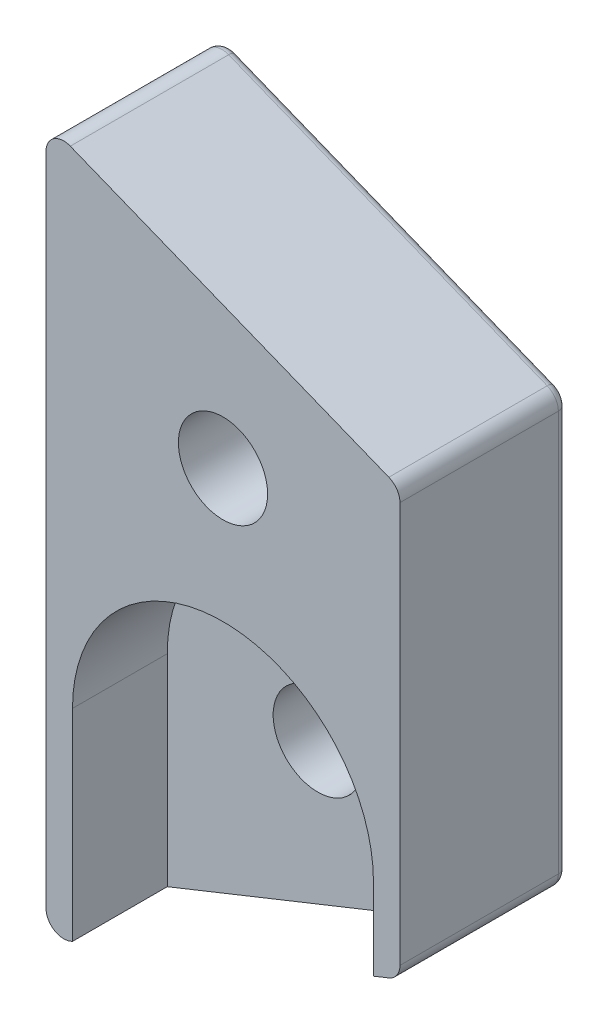
ISO-10303-21;
HEADER;
FILE_DESCRIPTION(('STEP AP214'),'2;1');
FILE_NAME('part.step','',(''),(''),'','','');
FILE_SCHEMA(('AUTOMOTIVE_DESIGN { 1 0 10303 214 1 1 1 1 }'));
ENDSEC;
DATA;
#1=APPLICATION_CONTEXT('core data for automotive mechanical design processes');
#2=APPLICATION_PROTOCOL_DEFINITION('international standard','automotive_design',2000,#1);
#3=PRODUCT_CONTEXT('',#1,'mechanical');
#4=PRODUCT('Part','Part','',(#3));
#5=PRODUCT_RELATED_PRODUCT_CATEGORY('part','',(#4));
#6=PRODUCT_DEFINITION_FORMATION('','',#4);
#7=PRODUCT_DEFINITION_CONTEXT('part definition',#1,'design');
#8=PRODUCT_DEFINITION('design','',#6,#7);
#9=PRODUCT_DEFINITION_SHAPE('','',#8);
#10=(LENGTH_UNIT() NAMED_UNIT(*) SI_UNIT(.MILLI.,.METRE.));
#11=(NAMED_UNIT(*) PLANE_ANGLE_UNIT() SI_UNIT($,.RADIAN.));
#12=(NAMED_UNIT(*) SI_UNIT($,.STERADIAN.) SOLID_ANGLE_UNIT());
#13=UNCERTAINTY_MEASURE_WITH_UNIT(LENGTH_MEASURE(1.E-05),#10,'distance_accuracy_value','');
#14=(GEOMETRIC_REPRESENTATION_CONTEXT(3) GLOBAL_UNCERTAINTY_ASSIGNED_CONTEXT((#13)) GLOBAL_UNIT_ASSIGNED_CONTEXT((#10,
#11,#12)) REPRESENTATION_CONTEXT('',''));
#15=CARTESIAN_POINT('',(0.,0.,0.));
#16=DIRECTION('',(0.,0.,1.));
#17=DIRECTION('',(1.,0.,0.));
#18=AXIS2_PLACEMENT_3D('',#15,#16,#17);
#19=CARTESIAN_POINT('',(7.9375,-22.225,7.5));
#20=DIRECTION('',(0.,0.,-1.));
#21=DIRECTION('',(-1.,0.,0.));
#22=AXIS2_PLACEMENT_3D('',#19,#20,#21);
#23=CYLINDRICAL_SURFACE('',#22,2.);
#24=CARTESIAN_POINT('',(7.9375,-22.225,0.));
#25=DIRECTION('',(0.,0.,1.));
#26=DIRECTION('',(1.,0.,0.));
#27=AXIS2_PLACEMENT_3D('',#24,#25,#26);
#28=CIRCLE('',#27,2.);
#29=CARTESIAN_POINT('',(9.9375,-22.225,0.));
#30=VERTEX_POINT('',#29);
#31=EDGE_CURVE('E249',#30,#30,#28,.T.);
#32=ORIENTED_EDGE('',*,*,#31,.F.);
#33=EDGE_LOOP('',(#32));
#34=FACE_BOUND('',#33,.T.);
#35=CARTESIAN_POINT('',(7.9375,-22.225,3.25));
#36=DIRECTION('',(0.,0.,1.));
#37=DIRECTION('',(1.,0.,0.));
#38=AXIS2_PLACEMENT_3D('',#35,#36,#37);
#39=CIRCLE('',#38,2.);
#40=CARTESIAN_POINT('',(9.9375,-22.225,3.25));
#41=VERTEX_POINT('',#40);
#42=EDGE_CURVE('E236',#41,#41,#39,.T.);
#43=ORIENTED_EDGE('',*,*,#42,.T.);
#44=EDGE_LOOP('',(#43));
#45=FACE_BOUND('',#44,.T.);
#46=ADVANCED_FACE('F50',(#34,#45),#23,.F.);
#47=CARTESIAN_POINT('',(0.,0.,7.5));
#48=DIRECTION('',(0.,0.,-1.));
#49=DIRECTION('',(-1.,0.,0.));
#50=AXIS2_PLACEMENT_3D('',#47,#48,#49);
#51=PLANE('',#50);
#52=CARTESIAN_POINT('',(7.9375,-22.225,7.5));
#53=DIRECTION('',(0.,0.,1.));
#54=DIRECTION('',(1.,0.,0.));
#55=AXIS2_PLACEMENT_3D('',#52,#53,#54);
#56=CIRCLE('',#55,6.75);
#57=CARTESIAN_POINT('',(14.6875,-22.225,7.5));
#58=VERTEX_POINT('',#57);
#59=CARTESIAN_POINT('',(1.1875,-22.225,7.5));
#60=VERTEX_POINT('',#59);
#61=EDGE_CURVE('E203',#58,#60,#56,.T.);
#62=ORIENTED_EDGE('',*,*,#61,.F.);
#63=DIRECTION('',(0.,1.,0.));
#64=VECTOR('',#63,1.);
#65=CARTESIAN_POINT('',(14.6875,-22.225,7.5));
#66=LINE('',#65,#64);
#67=CARTESIAN_POINT('',(14.6875,-25.875,7.5));
#68=VERTEX_POINT('',#67);
#69=EDGE_CURVE('E219',#68,#58,#66,.T.);
#70=ORIENTED_EDGE('',*,*,#69,.F.);
#71=DIRECTION('',(0.928476690885259,0.371390676354104,0.));
#72=VECTOR('',#71,1.);
#73=CARTESIAN_POINT('',(15.875,-25.4,7.5));
#74=LINE('',#73,#72);
#75=CARTESIAN_POINT('',(15.3760413493561,-25.5995834602576,7.5));
#76=VERTEX_POINT('',#75);
#77=EDGE_CURVE('E257',#68,#76,#74,.T.);
#78=ORIENTED_EDGE('',*,*,#77,.T.);
#79=CARTESIAN_POINT('',(15.08125,-24.8626050868674,7.5));
#80=DIRECTION('',(0.,0.,-1.));
#81=DIRECTION('',(-1.,0.,0.));
#82=AXIS2_PLACEMENT_3D('',#79,#80,#81);
#83=CIRCLE('',#82,0.79375);
#84=CARTESIAN_POINT('',(15.875,-24.8626050868674,7.5));
#85=VERTEX_POINT('',#84);
#86=EDGE_CURVE('E295',#76,#85,#83,.F.);
#87=ORIENTED_EDGE('',*,*,#86,.T.);
#88=DIRECTION('',(0.,1.,0.));
#89=VECTOR('',#88,1.);
#90=CARTESIAN_POINT('',(15.875,-6.35,7.5));
#91=LINE('',#90,#89);
#92=CARTESIAN_POINT('',(15.875,-6.8873949131326,7.5));
#93=VERTEX_POINT('',#92);
#94=EDGE_CURVE('E264',#85,#93,#91,.T.);
#95=ORIENTED_EDGE('',*,*,#94,.T.);
#96=CARTESIAN_POINT('',(15.08125,-6.8873949131326,7.5));
#97=DIRECTION('',(0.,0.,-1.));
#98=DIRECTION('',(-1.,0.,0.));
#99=AXIS2_PLACEMENT_3D('',#96,#97,#98);
#100=CIRCLE('',#99,0.79375);
#101=CARTESIAN_POINT('',(15.3760413493561,-6.15041653974242,7.5));
#102=VERTEX_POINT('',#101);
#103=EDGE_CURVE('E286',#93,#102,#100,.F.);
#104=ORIENTED_EDGE('',*,*,#103,.T.);
#105=DIRECTION('',(-0.928476690885259,0.371390676354103,0.));
#106=VECTOR('',#105,1.);
#107=CARTESIAN_POINT('',(0.,0.,7.5));
#108=LINE('',#107,#106);
#109=CARTESIAN_POINT('',(1.08854134935607,-0.435416539742427,7.5));
#110=VERTEX_POINT('',#109);
#111=EDGE_CURVE('E267',#102,#110,#108,.T.);
#112=ORIENTED_EDGE('',*,*,#111,.T.);
#113=CARTESIAN_POINT('',(0.79375,-1.1723949131326,7.5));
#114=DIRECTION('',(0.,0.,-1.));
#115=DIRECTION('',(-1.,0.,0.));
#116=AXIS2_PLACEMENT_3D('',#113,#114,#115);
#117=CIRCLE('',#116,0.79375);
#118=CARTESIAN_POINT('',(0.,-1.1723949131326,7.5));
#119=VERTEX_POINT('',#118);
#120=EDGE_CURVE('E287',#110,#119,#117,.F.);
#121=ORIENTED_EDGE('',*,*,#120,.T.);
#122=DIRECTION('',(0.,-1.,0.));
#123=VECTOR('',#122,1.);
#124=CARTESIAN_POINT('',(0.,-31.75,7.5));
#125=LINE('',#124,#123);
#126=CARTESIAN_POINT('',(0.,-30.5776050868674,7.5));
#127=VERTEX_POINT('',#126);
#128=EDGE_CURVE('E258',#119,#127,#125,.T.);
#129=ORIENTED_EDGE('',*,*,#128,.T.);
#130=CARTESIAN_POINT('',(0.793749999999999,-30.5776050868674,7.5));
#131=DIRECTION('',(0.,0.,-1.));
#132=DIRECTION('',(-1.,0.,0.));
#133=AXIS2_PLACEMENT_3D('',#130,#131,#132);
#134=CIRCLE('',#133,0.79375);
#135=CARTESIAN_POINT('',(1.08854134935607,-31.3145834602576,7.5));
#136=VERTEX_POINT('',#135);
#137=EDGE_CURVE('E293',#127,#136,#134,.F.);
#138=ORIENTED_EDGE('',*,*,#137,.T.);
#139=CARTESIAN_POINT('',(1.1875,-31.275,7.5));
#140=VERTEX_POINT('',#139);
#141=EDGE_CURVE('E261',#136,#140,#74,.T.);
#142=ORIENTED_EDGE('',*,*,#141,.T.);
#143=DIRECTION('',(0.,-1.,0.));
#144=VECTOR('',#143,1.);
#145=CARTESIAN_POINT('',(1.1875,-22.225,7.5));
#146=LINE('',#145,#144);
#147=EDGE_CURVE('E221',#60,#140,#146,.T.);
#148=ORIENTED_EDGE('',*,*,#147,.F.);
#149=EDGE_LOOP('',(#62,#70,#78,#87,#95,#104,#112,#121,#129,#138,#142,#148));
#150=FACE_BOUND('',#149,.T.);
#151=CARTESIAN_POINT('',(7.9375,-9.525,7.5));
#152=DIRECTION('',(0.,0.,1.));
#153=DIRECTION('',(1.,0.,0.));
#154=AXIS2_PLACEMENT_3D('',#151,#152,#153);
#155=CIRCLE('',#154,2.);
#156=CARTESIAN_POINT('',(9.9375,-9.525,7.5));
#157=VERTEX_POINT('',#156);
#158=EDGE_CURVE('E244',#157,#157,#155,.T.);
#159=ORIENTED_EDGE('',*,*,#158,.F.);
#160=EDGE_LOOP('',(#159));
#161=FACE_BOUND('',#160,.T.);
#162=ADVANCED_FACE('F409',(#150,#161),#51,.F.);
#163=CARTESIAN_POINT('',(0.,0.,0.));
#164=DIRECTION('',(0.,0.,-1.));
#165=DIRECTION('',(-1.,0.,0.));
#166=AXIS2_PLACEMENT_3D('',#163,#164,#165);
#167=PLANE('',#166);
#168=DIRECTION('',(-0.928476690885259,0.371390676354103,0.));
#169=VECTOR('',#168,1.);
#170=CARTESIAN_POINT('',(15.228645674678,-6.51890572643751,0.));
#171=LINE('',#170,#169);
#172=CARTESIAN_POINT('',(0.941145674678034,-0.803905726437515,0.));
#173=VERTEX_POINT('',#172);
#174=CARTESIAN_POINT('',(15.228645674678,-6.51890572643751,0.));
#175=VERTEX_POINT('',#174);
#176=EDGE_CURVE('E313',#173,#175,#171,.F.);
#177=ORIENTED_EDGE('',*,*,#176,.T.);
#178=CARTESIAN_POINT('',(15.08125,-6.8873949131326,0.));
#179=DIRECTION('',(0.,0.,-1.));
#180=DIRECTION('',(-1.,0.,0.));
#181=AXIS2_PLACEMENT_3D('',#178,#179,#180);
#182=CIRCLE('',#181,0.396875);
#183=CARTESIAN_POINT('',(15.478125,-6.8873949131326,0.));
#184=VERTEX_POINT('',#183);
#185=EDGE_CURVE('E333',#175,#184,#182,.T.);
#186=ORIENTED_EDGE('',*,*,#185,.T.);
#187=DIRECTION('',(0.,1.,0.));
#188=VECTOR('',#187,1.);
#189=CARTESIAN_POINT('',(15.478125,-24.8626050868674,0.));
#190=LINE('',#189,#188);
#191=CARTESIAN_POINT('',(15.478125,-24.8626050868674,0.));
#192=VERTEX_POINT('',#191);
#193=EDGE_CURVE('E335',#184,#192,#190,.F.);
#194=ORIENTED_EDGE('',*,*,#193,.T.);
#195=CARTESIAN_POINT('',(15.08125,-24.8626050868674,0.));
#196=DIRECTION('',(0.,0.,-1.));
#197=DIRECTION('',(-1.,0.,0.));
#198=AXIS2_PLACEMENT_3D('',#195,#196,#197);
#199=CIRCLE('',#198,0.396875);
#200=CARTESIAN_POINT('',(15.228645674678,-25.2310942735625,0.));
#201=VERTEX_POINT('',#200);
#202=EDGE_CURVE('E328',#192,#201,#199,.T.);
#203=ORIENTED_EDGE('',*,*,#202,.T.);
#204=DIRECTION('',(0.928476690885259,0.371390676354104,0.));
#205=VECTOR('',#204,1.);
#206=CARTESIAN_POINT('',(0.94114567467803,-30.9460942735625,0.));
#207=LINE('',#206,#205);
#208=CARTESIAN_POINT('',(0.941145674678031,-30.9460942735625,0.));
#209=VERTEX_POINT('',#208);
#210=EDGE_CURVE('E326',#201,#209,#207,.F.);
#211=ORIENTED_EDGE('',*,*,#210,.T.);
#212=CARTESIAN_POINT('',(0.793749999999999,-30.5776050868674,0.));
#213=DIRECTION('',(0.,0.,-1.));
#214=DIRECTION('',(-1.,0.,0.));
#215=AXIS2_PLACEMENT_3D('',#212,#213,#214);
#216=CIRCLE('',#215,0.396875);
#217=CARTESIAN_POINT('',(0.396875,-30.5776050868674,0.));
#218=VERTEX_POINT('',#217);
#219=EDGE_CURVE('E323',#209,#218,#216,.T.);
#220=ORIENTED_EDGE('',*,*,#219,.T.);
#221=DIRECTION('',(0.,-1.,0.));
#222=VECTOR('',#221,1.);
#223=CARTESIAN_POINT('',(0.396875,-1.1723949131326,0.));
#224=LINE('',#223,#222);
#225=CARTESIAN_POINT('',(0.396875,-1.1723949131326,0.));
#226=VERTEX_POINT('',#225);
#227=EDGE_CURVE('E319',#218,#226,#224,.F.);
#228=ORIENTED_EDGE('',*,*,#227,.T.);
#229=CARTESIAN_POINT('',(0.79375,-1.1723949131326,0.));
#230=DIRECTION('',(0.,0.,-1.));
#231=DIRECTION('',(-1.,0.,0.));
#232=AXIS2_PLACEMENT_3D('',#229,#230,#231);
#233=CIRCLE('',#232,0.396875);
#234=EDGE_CURVE('E320',#226,#173,#233,.T.);
#235=ORIENTED_EDGE('',*,*,#234,.T.);
#236=EDGE_LOOP('',(#177,#186,#194,#203,#211,#220,#228,#235));
#237=FACE_BOUND('',#236,.T.);
#238=ORIENTED_EDGE('',*,*,#31,.T.);
#239=EDGE_LOOP('',(#238));
#240=FACE_BOUND('',#239,.T.);
#241=CARTESIAN_POINT('',(7.9375,-9.525,0.));
#242=DIRECTION('',(0.,0.,1.));
#243=DIRECTION('',(1.,0.,0.));
#244=AXIS2_PLACEMENT_3D('',#241,#242,#243);
#245=CIRCLE('',#244,2.);
#246=CARTESIAN_POINT('',(9.9375,-9.525,0.));
#247=VERTEX_POINT('',#246);
#248=EDGE_CURVE('E246',#247,#247,#245,.T.);
#249=ORIENTED_EDGE('',*,*,#248,.T.);
#250=EDGE_LOOP('',(#249));
#251=FACE_BOUND('',#250,.T.);
#252=ADVANCED_FACE('F430',(#237,#240,#251),#167,.T.);
#253=CARTESIAN_POINT('',(0.,-31.75,7.5));
#254=DIRECTION('',(1.,0.,0.));
#255=DIRECTION('',(0.,0.,-1.));
#256=AXIS2_PLACEMENT_3D('',#253,#254,#255);
#257=PLANE('',#256);
#258=DIRECTION('',(0.,0.,-1.));
#259=VECTOR('',#258,1.);
#260=CARTESIAN_POINT('',(0.,-1.1723949131326,7.5));
#261=LINE('',#260,#259);
#262=CARTESIAN_POINT('',(0.,-1.1723949131326,0.396874999999998));
#263=VERTEX_POINT('',#262);
#264=EDGE_CURVE('E278',#119,#263,#261,.T.);
#265=ORIENTED_EDGE('',*,*,#264,.T.);
#266=DIRECTION('',(0.,-1.,0.));
#267=VECTOR('',#266,1.);
#268=CARTESIAN_POINT('',(0.,-30.5776050868674,0.396875));
#269=LINE('',#268,#267);
#270=CARTESIAN_POINT('',(0.,-30.5776050868674,0.396875));
#271=VERTEX_POINT('',#270);
#272=EDGE_CURVE('E352',#263,#271,#269,.T.);
#273=ORIENTED_EDGE('',*,*,#272,.T.);
#274=DIRECTION('',(0.,0.,-1.));
#275=VECTOR('',#274,1.);
#276=CARTESIAN_POINT('',(0.,-30.5776050868674,7.5));
#277=LINE('',#276,#275);
#278=EDGE_CURVE('E281',#271,#127,#277,.F.);
#279=ORIENTED_EDGE('',*,*,#278,.T.);
#280=ORIENTED_EDGE('',*,*,#128,.F.);
#281=EDGE_LOOP('',(#265,#273,#279,#280));
#282=FACE_BOUND('',#281,.T.);
#283=ADVANCED_FACE('F411',(#282),#257,.F.);
#284=CARTESIAN_POINT('',(15.875,-25.4,7.5));
#285=DIRECTION('',(-0.371390676354104,0.928476690885259,0.));
#286=DIRECTION('',(-0.928476690885259,-0.371390676354104,0.));
#287=AXIS2_PLACEMENT_3D('',#284,#285,#286);
#288=PLANE('',#287);
#289=DIRECTION('',(0.,0.,-1.));
#290=VECTOR('',#289,1.);
#291=CARTESIAN_POINT('',(1.08854134935607,-31.3145834602576,7.5));
#292=LINE('',#291,#290);
#293=CARTESIAN_POINT('',(1.08854134935607,-31.3145834602576,0.396875));
#294=VERTEX_POINT('',#293);
#295=EDGE_CURVE('E277',#136,#294,#292,.T.);
#296=ORIENTED_EDGE('',*,*,#295,.T.);
#297=DIRECTION('',(0.928476690885259,0.371390676354104,0.));
#298=VECTOR('',#297,1.);
#299=CARTESIAN_POINT('',(15.3760413493561,-25.5995834602576,0.396875));
#300=LINE('',#299,#298);
#301=CARTESIAN_POINT('',(15.3760413493561,-25.5995834602576,0.396875));
#302=VERTEX_POINT('',#301);
#303=EDGE_CURVE('E349',#294,#302,#300,.T.);
#304=ORIENTED_EDGE('',*,*,#303,.T.);
#305=DIRECTION('',(0.,0.,-1.));
#306=VECTOR('',#305,1.);
#307=CARTESIAN_POINT('',(15.3760413493561,-25.5995834602576,7.5));
#308=LINE('',#307,#306);
#309=EDGE_CURVE('E272',#302,#76,#308,.F.);
#310=ORIENTED_EDGE('',*,*,#309,.T.);
#311=ORIENTED_EDGE('',*,*,#77,.F.);
#312=DIRECTION('',(0.,0.,1.));
#313=VECTOR('',#312,1.);
#314=CARTESIAN_POINT('',(14.6875,-25.875,3.25));
#315=LINE('',#314,#313);
#316=CARTESIAN_POINT('',(14.6875,-25.875,3.25));
#317=VERTEX_POINT('',#316);
#318=EDGE_CURVE('E239',#317,#68,#315,.T.);
#319=ORIENTED_EDGE('',*,*,#318,.F.);
#320=DIRECTION('',(0.928476690885259,0.371390676354104,0.));
#321=VECTOR('',#320,1.);
#322=CARTESIAN_POINT('',(1.1875,-31.275,3.25));
#323=LINE('',#322,#321);
#324=CARTESIAN_POINT('',(1.1875,-31.275,3.25));
#325=VERTEX_POINT('',#324);
#326=EDGE_CURVE('E214',#325,#317,#323,.T.);
#327=ORIENTED_EDGE('',*,*,#326,.F.);
#328=DIRECTION('',(0.,0.,1.));
#329=VECTOR('',#328,1.);
#330=CARTESIAN_POINT('',(1.1875,-31.275,3.25));
#331=LINE('',#330,#329);
#332=EDGE_CURVE('E202',#325,#140,#331,.T.);
#333=ORIENTED_EDGE('',*,*,#332,.T.);
#334=ORIENTED_EDGE('',*,*,#141,.F.);
#335=EDGE_LOOP('',(#296,#304,#310,#311,#319,#327,#333,#334));
#336=FACE_BOUND('',#335,.T.);
#337=ADVANCED_FACE('F408',(#336),#288,.F.);
#338=CARTESIAN_POINT('',(15.875,-6.35,7.5));
#339=DIRECTION('',(-1.,0.,0.));
#340=DIRECTION('',(0.,0.,1.));
#341=AXIS2_PLACEMENT_3D('',#338,#339,#340);
#342=PLANE('',#341);
#343=DIRECTION('',(0.,0.,-1.));
#344=VECTOR('',#343,1.);
#345=CARTESIAN_POINT('',(15.875,-24.8626050868674,7.5));
#346=LINE('',#345,#344);
#347=CARTESIAN_POINT('',(15.875,-24.8626050868674,0.396875));
#348=VERTEX_POINT('',#347);
#349=EDGE_CURVE('E302',#85,#348,#346,.T.);
#350=ORIENTED_EDGE('',*,*,#349,.T.);
#351=DIRECTION('',(0.,1.,0.));
#352=VECTOR('',#351,1.);
#353=CARTESIAN_POINT('',(15.875,-6.8873949131326,0.396875));
#354=LINE('',#353,#352);
#355=CARTESIAN_POINT('',(15.875,-6.8873949131326,0.396875));
#356=VERTEX_POINT('',#355);
#357=EDGE_CURVE('E344',#348,#356,#354,.T.);
#358=ORIENTED_EDGE('',*,*,#357,.T.);
#359=DIRECTION('',(0.,0.,-1.));
#360=VECTOR('',#359,1.);
#361=CARTESIAN_POINT('',(15.875,-6.8873949131326,7.5));
#362=LINE('',#361,#360);
#363=EDGE_CURVE('E296',#356,#93,#362,.F.);
#364=ORIENTED_EDGE('',*,*,#363,.T.);
#365=ORIENTED_EDGE('',*,*,#94,.F.);
#366=EDGE_LOOP('',(#350,#358,#364,#365));
#367=FACE_BOUND('',#366,.T.);
#368=ADVANCED_FACE('F444',(#367),#342,.F.);
#369=CARTESIAN_POINT('',(0.,0.,7.5));
#370=DIRECTION('',(-0.371390676354103,-0.928476690885259,0.));
#371=DIRECTION('',(0.92847669088526,-0.371390676354104,0.));
#372=AXIS2_PLACEMENT_3D('',#369,#370,#371);
#373=PLANE('',#372);
#374=DIRECTION('',(0.,0.,-1.));
#375=VECTOR('',#374,1.);
#376=CARTESIAN_POINT('',(15.3760413493561,-6.15041653974242,7.5));
#377=LINE('',#376,#375);
#378=CARTESIAN_POINT('',(15.3760413493561,-6.15041653974242,0.396875));
#379=VERTEX_POINT('',#378);
#380=EDGE_CURVE('E306',#102,#379,#377,.T.);
#381=ORIENTED_EDGE('',*,*,#380,.T.);
#382=DIRECTION('',(-0.92847669088526,0.371390676354104,0.));
#383=VECTOR('',#382,1.);
#384=CARTESIAN_POINT('',(1.08854134935607,-0.435416539742427,0.396875));
#385=LINE('',#384,#383);
#386=CARTESIAN_POINT('',(1.08854134935607,-0.435416539742427,0.396875));
#387=VERTEX_POINT('',#386);
#388=EDGE_CURVE('E11',#379,#387,#385,.T.);
#389=ORIENTED_EDGE('',*,*,#388,.T.);
#390=DIRECTION('',(0.,0.,-1.));
#391=VECTOR('',#390,1.);
#392=CARTESIAN_POINT('',(1.08854134935607,-0.435416539742427,7.5));
#393=LINE('',#392,#391);
#394=EDGE_CURVE('E303',#387,#110,#393,.F.);
#395=ORIENTED_EDGE('',*,*,#394,.T.);
#396=ORIENTED_EDGE('',*,*,#111,.F.);
#397=EDGE_LOOP('',(#381,#389,#395,#396));
#398=FACE_BOUND('',#397,.T.);
#399=ADVANCED_FACE('F452',(#398),#373,.F.);
#400=CARTESIAN_POINT('',(7.9375,-9.525,7.5));
#401=DIRECTION('',(0.,0.,-1.));
#402=DIRECTION('',(-1.,0.,0.));
#403=AXIS2_PLACEMENT_3D('',#400,#401,#402);
#404=CYLINDRICAL_SURFACE('',#403,2.);
#405=ORIENTED_EDGE('',*,*,#158,.T.);
#406=EDGE_LOOP('',(#405));
#407=FACE_BOUND('',#406,.T.);
#408=ORIENTED_EDGE('',*,*,#248,.F.);
#409=EDGE_LOOP('',(#408));
#410=FACE_BOUND('',#409,.T.);
#411=ADVANCED_FACE('F454',(#407,#410),#404,.F.);
#412=CARTESIAN_POINT('',(0.793749999999999,-30.5776050868674,7.5));
#413=DIRECTION('',(0.,0.,-1.));
#414=DIRECTION('',(-1.,0.,0.));
#415=AXIS2_PLACEMENT_3D('',#412,#413,#414);
#416=CYLINDRICAL_SURFACE('',#415,0.79375);
#417=ORIENTED_EDGE('',*,*,#278,.F.);
#418=CARTESIAN_POINT('',(0.793749999999999,-30.5776050868674,0.396875));
#419=DIRECTION('',(0.,0.,-1.));
#420=DIRECTION('',(-1.,0.,0.));
#421=AXIS2_PLACEMENT_3D('',#418,#419,#420);
#422=CIRCLE('',#421,0.79375);
#423=EDGE_CURVE('E355',#271,#294,#422,.F.);
#424=ORIENTED_EDGE('',*,*,#423,.T.);
#425=ORIENTED_EDGE('',*,*,#295,.F.);
#426=ORIENTED_EDGE('',*,*,#137,.F.);
#427=EDGE_LOOP('',(#417,#424,#425,#426));
#428=FACE_BOUND('',#427,.T.);
#429=ADVANCED_FACE('F405',(#428),#416,.T.);
#430=CARTESIAN_POINT('',(15.08125,-24.8626050868674,7.5));
#431=DIRECTION('',(0.,0.,-1.));
#432=DIRECTION('',(-1.,0.,0.));
#433=AXIS2_PLACEMENT_3D('',#430,#431,#432);
#434=CYLINDRICAL_SURFACE('',#433,0.79375);
#435=ORIENTED_EDGE('',*,*,#309,.F.);
#436=CARTESIAN_POINT('',(15.08125,-24.8626050868674,0.396875));
#437=DIRECTION('',(0.,0.,-1.));
#438=DIRECTION('',(-1.,0.,0.));
#439=AXIS2_PLACEMENT_3D('',#436,#437,#438);
#440=CIRCLE('',#439,0.79375);
#441=EDGE_CURVE('E347',#302,#348,#440,.F.);
#442=ORIENTED_EDGE('',*,*,#441,.T.);
#443=ORIENTED_EDGE('',*,*,#349,.F.);
#444=ORIENTED_EDGE('',*,*,#86,.F.);
#445=EDGE_LOOP('',(#435,#442,#443,#444));
#446=FACE_BOUND('',#445,.T.);
#447=ADVANCED_FACE('F438',(#446),#434,.T.);
#448=CARTESIAN_POINT('',(15.08125,-6.8873949131326,7.5));
#449=DIRECTION('',(0.,0.,-1.));
#450=DIRECTION('',(-1.,0.,0.));
#451=AXIS2_PLACEMENT_3D('',#448,#449,#450);
#452=CYLINDRICAL_SURFACE('',#451,0.79375);
#453=ORIENTED_EDGE('',*,*,#363,.F.);
#454=CARTESIAN_POINT('',(15.08125,-6.8873949131326,0.396874999999998));
#455=DIRECTION('',(0.,0.,-1.));
#456=DIRECTION('',(-1.,0.,0.));
#457=AXIS2_PLACEMENT_3D('',#454,#455,#456);
#458=CIRCLE('',#457,0.79375);
#459=EDGE_CURVE('E339',#356,#379,#458,.F.);
#460=ORIENTED_EDGE('',*,*,#459,.T.);
#461=ORIENTED_EDGE('',*,*,#380,.F.);
#462=ORIENTED_EDGE('',*,*,#103,.F.);
#463=EDGE_LOOP('',(#453,#460,#461,#462));
#464=FACE_BOUND('',#463,.T.);
#465=ADVANCED_FACE('F449',(#464),#452,.T.);
#466=CARTESIAN_POINT('',(0.79375,-1.1723949131326,7.5));
#467=DIRECTION('',(0.,0.,-1.));
#468=DIRECTION('',(-1.,0.,0.));
#469=AXIS2_PLACEMENT_3D('',#466,#467,#468);
#470=CYLINDRICAL_SURFACE('',#469,0.79375);
#471=ORIENTED_EDGE('',*,*,#394,.F.);
#472=CARTESIAN_POINT('',(0.79375,-1.1723949131326,0.396874999999998));
#473=DIRECTION('',(0.,0.,-1.));
#474=DIRECTION('',(-1.,0.,0.));
#475=AXIS2_PLACEMENT_3D('',#472,#473,#474);
#476=CIRCLE('',#475,0.79375);
#477=EDGE_CURVE('E60',#387,#263,#476,.F.);
#478=ORIENTED_EDGE('',*,*,#477,.T.);
#479=ORIENTED_EDGE('',*,*,#264,.F.);
#480=ORIENTED_EDGE('',*,*,#120,.F.);
#481=EDGE_LOOP('',(#471,#478,#479,#480));
#482=FACE_BOUND('',#481,.T.);
#483=ADVANCED_FACE('F413',(#482),#470,.T.);
#484=CARTESIAN_POINT('',(7.9375,-22.225,3.25));
#485=DIRECTION('',(0.,0.,1.));
#486=DIRECTION('',(1.,0.,0.));
#487=AXIS2_PLACEMENT_3D('',#484,#485,#486);
#488=CYLINDRICAL_SURFACE('',#487,6.75);
#489=ORIENTED_EDGE('',*,*,#61,.T.);
#490=DIRECTION('',(0.,0.,1.));
#491=VECTOR('',#490,1.);
#492=CARTESIAN_POINT('',(1.1875,-22.225,3.25));
#493=LINE('',#492,#491);
#494=CARTESIAN_POINT('',(1.1875,-22.225,3.25));
#495=VERTEX_POINT('',#494);
#496=EDGE_CURVE('E191',#495,#60,#493,.T.);
#497=ORIENTED_EDGE('',*,*,#496,.F.);
#498=CARTESIAN_POINT('',(7.9375,-22.225,3.25));
#499=DIRECTION('',(0.,0.,1.));
#500=DIRECTION('',(1.,0.,0.));
#501=AXIS2_PLACEMENT_3D('',#498,#499,#500);
#502=CIRCLE('',#501,6.75);
#503=CARTESIAN_POINT('',(14.6875,-22.225,3.25));
#504=VERTEX_POINT('',#503);
#505=EDGE_CURVE('E196',#504,#495,#502,.T.);
#506=ORIENTED_EDGE('',*,*,#505,.F.);
#507=DIRECTION('',(0.,0.,1.));
#508=VECTOR('',#507,1.);
#509=CARTESIAN_POINT('',(14.6875,-22.225,3.25));
#510=LINE('',#509,#508);
#511=EDGE_CURVE('E233',#504,#58,#510,.T.);
#512=ORIENTED_EDGE('',*,*,#511,.T.);
#513=EDGE_LOOP('',(#489,#497,#506,#512));
#514=FACE_BOUND('',#513,.T.);
#515=ADVANCED_FACE('F198',(#514),#488,.F.);
#516=CARTESIAN_POINT('',(14.6875,-22.225,3.25));
#517=DIRECTION('',(1.,0.,0.));
#518=DIRECTION('',(0.,1.,0.));
#519=AXIS2_PLACEMENT_3D('',#516,#517,#518);
#520=PLANE('',#519);
#521=ORIENTED_EDGE('',*,*,#69,.T.);
#522=ORIENTED_EDGE('',*,*,#511,.F.);
#523=DIRECTION('',(0.,1.,0.));
#524=VECTOR('',#523,1.);
#525=CARTESIAN_POINT('',(14.6875,-22.225,3.25));
#526=LINE('',#525,#524);
#527=EDGE_CURVE('E206',#317,#504,#526,.T.);
#528=ORIENTED_EDGE('',*,*,#527,.F.);
#529=ORIENTED_EDGE('',*,*,#318,.T.);
#530=EDGE_LOOP('',(#521,#522,#528,#529));
#531=FACE_BOUND('',#530,.T.);
#532=ADVANCED_FACE('F513',(#531),#520,.F.);
#533=CARTESIAN_POINT('',(1.1875,-22.225,3.25));
#534=DIRECTION('',(-1.,0.,0.));
#535=DIRECTION('',(0.,-1.,0.));
#536=AXIS2_PLACEMENT_3D('',#533,#534,#535);
#537=PLANE('',#536);
#538=ORIENTED_EDGE('',*,*,#147,.T.);
#539=ORIENTED_EDGE('',*,*,#332,.F.);
#540=DIRECTION('',(0.,-1.,0.));
#541=VECTOR('',#540,1.);
#542=CARTESIAN_POINT('',(1.1875,-22.225,3.25));
#543=LINE('',#542,#541);
#544=EDGE_CURVE('E207',#495,#325,#543,.T.);
#545=ORIENTED_EDGE('',*,*,#544,.F.);
#546=ORIENTED_EDGE('',*,*,#496,.T.);
#547=EDGE_LOOP('',(#538,#539,#545,#546));
#548=FACE_BOUND('',#547,.T.);
#549=ADVANCED_FACE('F209',(#548),#537,.F.);
#550=CARTESIAN_POINT('',(7.9375,-22.225,3.25));
#551=DIRECTION('',(0.,0.,1.));
#552=DIRECTION('',(1.,0.,0.));
#553=AXIS2_PLACEMENT_3D('',#550,#551,#552);
#554=PLANE('',#553);
#555=ORIENTED_EDGE('',*,*,#42,.F.);
#556=EDGE_LOOP('',(#555));
#557=FACE_BOUND('',#556,.T.);
#558=ORIENTED_EDGE('',*,*,#505,.T.);
#559=ORIENTED_EDGE('',*,*,#544,.T.);
#560=ORIENTED_EDGE('',*,*,#326,.T.);
#561=ORIENTED_EDGE('',*,*,#527,.T.);
#562=EDGE_LOOP('',(#558,#559,#560,#561));
#563=FACE_BOUND('',#562,.T.);
#564=ADVANCED_FACE('F220',(#557,#563),#554,.T.);
#565=CARTESIAN_POINT('',(0.793749999999999,-30.5776050868674,0.396875));
#566=DIRECTION('',(0.,0.,-1.));
#567=DIRECTION('',(-1.,0.,0.));
#568=AXIS2_PLACEMENT_3D('',#565,#566,#567);
#569=DEGENERATE_TOROIDAL_SURFACE('',#568,0.396875,0.396875,.T.);
#570=CARTESIAN_POINT('',(0.941145674678033,-30.9460942735625,0.396875));
#571=DIRECTION('',(0.928476690885259,0.371390676354104,0.));
#572=DIRECTION('',(-0.371390676354104,0.92847669088526,0.));
#573=AXIS2_PLACEMENT_3D('',#570,#571,#572);
#574=CIRCLE('',#573,0.396875);
#575=EDGE_CURVE('E381',#294,#209,#574,.T.);
#576=ORIENTED_EDGE('',*,*,#575,.F.);
#577=ORIENTED_EDGE('',*,*,#423,.F.);
#578=CARTESIAN_POINT('',(0.396874999999999,-30.5776050868674,0.396875));
#579=DIRECTION('',(0.,1.,0.));
#580=DIRECTION('',(0.,0.,1.));
#581=AXIS2_PLACEMENT_3D('',#578,#579,#580);
#582=CIRCLE('',#581,0.396875);
#583=EDGE_CURVE('E51',#218,#271,#582,.T.);
#584=ORIENTED_EDGE('',*,*,#583,.F.);
#585=ORIENTED_EDGE('',*,*,#219,.F.);
#586=EDGE_LOOP('',(#576,#577,#584,#585));
#587=FACE_BOUND('',#586,.T.);
#588=ADVANCED_FACE('F47',(#587),#569,.T.);
#589=CARTESIAN_POINT('',(0.396875,-31.75,0.396875));
#590=DIRECTION('',(0.,1.,0.));
#591=DIRECTION('',(0.,0.,1.));
#592=AXIS2_PLACEMENT_3D('',#589,#590,#591);
#593=CYLINDRICAL_SURFACE('',#592,0.396875);
#594=ORIENTED_EDGE('',*,*,#583,.T.);
#595=ORIENTED_EDGE('',*,*,#272,.F.);
#596=CARTESIAN_POINT('',(0.396875,-1.1723949131326,0.396875));
#597=DIRECTION('',(0.,1.,0.));
#598=DIRECTION('',(0.,0.,1.));
#599=AXIS2_PLACEMENT_3D('',#596,#597,#598);
#600=CIRCLE('',#599,0.396875);
#601=EDGE_CURVE('E378',#226,#263,#600,.T.);
#602=ORIENTED_EDGE('',*,*,#601,.F.);
#603=ORIENTED_EDGE('',*,*,#227,.F.);
#604=EDGE_LOOP('',(#594,#595,#602,#603));
#605=FACE_BOUND('',#604,.T.);
#606=ADVANCED_FACE('F394',(#605),#593,.T.);
#607=CARTESIAN_POINT('',(15.727604325322,-25.0315108133049,0.396875));
#608=DIRECTION('',(-0.928476690885259,-0.371390676354104,0.));
#609=DIRECTION('',(0.371390676354104,-0.928476690885259,0.));
#610=AXIS2_PLACEMENT_3D('',#607,#608,#609);
#611=CYLINDRICAL_SURFACE('',#610,0.396875);
#612=ORIENTED_EDGE('',*,*,#575,.T.);
#613=ORIENTED_EDGE('',*,*,#210,.F.);
#614=CARTESIAN_POINT('',(15.228645674678,-25.2310942735625,0.396875));
#615=DIRECTION('',(0.928476690885258,0.371390676354106,0.));
#616=DIRECTION('',(-0.371390676354106,0.928476690885258,0.));
#617=AXIS2_PLACEMENT_3D('',#614,#615,#616);
#618=CIRCLE('',#617,0.396875);
#619=EDGE_CURVE('E372',#302,#201,#618,.T.);
#620=ORIENTED_EDGE('',*,*,#619,.F.);
#621=ORIENTED_EDGE('',*,*,#303,.F.);
#622=EDGE_LOOP('',(#612,#613,#620,#621));
#623=FACE_BOUND('',#622,.T.);
#624=ADVANCED_FACE('F431',(#623),#611,.T.);
#625=CARTESIAN_POINT('',(0.79375,-1.1723949131326,0.396875));
#626=DIRECTION('',(0.,0.,-1.));
#627=DIRECTION('',(-1.,0.,0.));
#628=AXIS2_PLACEMENT_3D('',#625,#626,#627);
#629=DEGENERATE_TOROIDAL_SURFACE('',#628,0.396875,0.396875,.T.);
#630=ORIENTED_EDGE('',*,*,#601,.T.);
#631=ORIENTED_EDGE('',*,*,#477,.F.);
#632=CARTESIAN_POINT('',(0.941145674678035,-0.803905726437514,0.396875));
#633=DIRECTION('',(0.928476690885259,-0.371390676354103,0.));
#634=DIRECTION('',(0.371390676354103,0.92847669088526,0.));
#635=AXIS2_PLACEMENT_3D('',#632,#633,#634);
#636=CIRCLE('',#635,0.396875);
#637=EDGE_CURVE('E367',#173,#387,#636,.T.);
#638=ORIENTED_EDGE('',*,*,#637,.F.);
#639=ORIENTED_EDGE('',*,*,#234,.F.);
#640=EDGE_LOOP('',(#630,#631,#638,#639));
#641=FACE_BOUND('',#640,.T.);
#642=ADVANCED_FACE('F420',(#641),#629,.T.);
#643=CARTESIAN_POINT('',(15.08125,-24.8626050868674,0.396875));
#644=DIRECTION('',(0.,0.,-1.));
#645=DIRECTION('',(-1.,0.,0.));
#646=AXIS2_PLACEMENT_3D('',#643,#644,#645);
#647=DEGENERATE_TOROIDAL_SURFACE('',#646,0.396875,0.396875,.T.);
#648=ORIENTED_EDGE('',*,*,#619,.T.);
#649=ORIENTED_EDGE('',*,*,#202,.F.);
#650=CARTESIAN_POINT('',(15.478125,-24.8626050868674,0.396875));
#651=DIRECTION('',(0.,1.,0.));
#652=DIRECTION('',(0.,0.,1.));
#653=AXIS2_PLACEMENT_3D('',#650,#651,#652);
#654=CIRCLE('',#653,0.396875);
#655=EDGE_CURVE('E368',#348,#192,#654,.T.);
#656=ORIENTED_EDGE('',*,*,#655,.F.);
#657=ORIENTED_EDGE('',*,*,#441,.F.);
#658=EDGE_LOOP('',(#648,#649,#656,#657));
#659=FACE_BOUND('',#658,.T.);
#660=ADVANCED_FACE('F432',(#659),#647,.T.);
#661=CARTESIAN_POINT('',(-0.147395674678035,-0.368489186695087,0.396875));
#662=DIRECTION('',(0.928476690885259,-0.371390676354103,0.));
#663=DIRECTION('',(0.371390676354103,0.928476690885259,0.));
#664=AXIS2_PLACEMENT_3D('',#661,#662,#663);
#665=CYLINDRICAL_SURFACE('',#664,0.396875);
#666=ORIENTED_EDGE('',*,*,#637,.T.);
#667=ORIENTED_EDGE('',*,*,#388,.F.);
#668=CARTESIAN_POINT('',(15.228645674678,-6.51890572643751,0.396875));
#669=DIRECTION('',(0.928476690885259,-0.371390676354105,0.));
#670=DIRECTION('',(0.371390676354105,0.928476690885259,0.));
#671=AXIS2_PLACEMENT_3D('',#668,#669,#670);
#672=CIRCLE('',#671,0.396875);
#673=EDGE_CURVE('E361',#175,#379,#672,.T.);
#674=ORIENTED_EDGE('',*,*,#673,.F.);
#675=ORIENTED_EDGE('',*,*,#176,.F.);
#676=EDGE_LOOP('',(#666,#667,#674,#675));
#677=FACE_BOUND('',#676,.T.);
#678=ADVANCED_FACE('F421',(#677),#665,.T.);
#679=CARTESIAN_POINT('',(15.478125,-6.35,0.396875));
#680=DIRECTION('',(0.,-1.,0.));
#681=DIRECTION('',(0.,0.,-1.));
#682=AXIS2_PLACEMENT_3D('',#679,#680,#681);
#683=CYLINDRICAL_SURFACE('',#682,0.396875);
#684=ORIENTED_EDGE('',*,*,#655,.T.);
#685=ORIENTED_EDGE('',*,*,#193,.F.);
#686=CARTESIAN_POINT('',(15.478125,-6.8873949131326,0.396875));
#687=DIRECTION('',(0.,1.,0.));
#688=DIRECTION('',(0.,0.,1.));
#689=AXIS2_PLACEMENT_3D('',#686,#687,#688);
#690=CIRCLE('',#689,0.396875);
#691=EDGE_CURVE('E358',#356,#184,#690,.T.);
#692=ORIENTED_EDGE('',*,*,#691,.F.);
#693=ORIENTED_EDGE('',*,*,#357,.F.);
#694=EDGE_LOOP('',(#684,#685,#692,#693));
#695=FACE_BOUND('',#694,.T.);
#696=ADVANCED_FACE('F495',(#695),#683,.T.);
#697=CARTESIAN_POINT('',(15.08125,-6.8873949131326,0.396875));
#698=DIRECTION('',(0.,0.,-1.));
#699=DIRECTION('',(-1.,0.,0.));
#700=AXIS2_PLACEMENT_3D('',#697,#698,#699);
#701=DEGENERATE_TOROIDAL_SURFACE('',#700,0.396875,0.396875,.T.);
#702=ORIENTED_EDGE('',*,*,#673,.T.);
#703=ORIENTED_EDGE('',*,*,#459,.F.);
#704=ORIENTED_EDGE('',*,*,#691,.T.);
#705=ORIENTED_EDGE('',*,*,#185,.F.);
#706=EDGE_LOOP('',(#702,#703,#704,#705));
#707=FACE_BOUND('',#706,.T.);
#708=ADVANCED_FACE('F487',(#707),#701,.T.);
#709=CLOSED_SHELL('',(#46,#162,#252,#283,#337,#368,#399,#411,#429,#447,#465,#483,#515,#532,#549,
#564,#588,#606,#624,#642,#660,#678,#696,#708));
#710=MANIFOLD_SOLID_BREP('B2',#709);
#711=ADVANCED_BREP_SHAPE_REPRESENTATION('',(#18,#710),#14);
#712=SHAPE_DEFINITION_REPRESENTATION(#9,#711);
ENDSEC;
END-ISO-10303-21;
